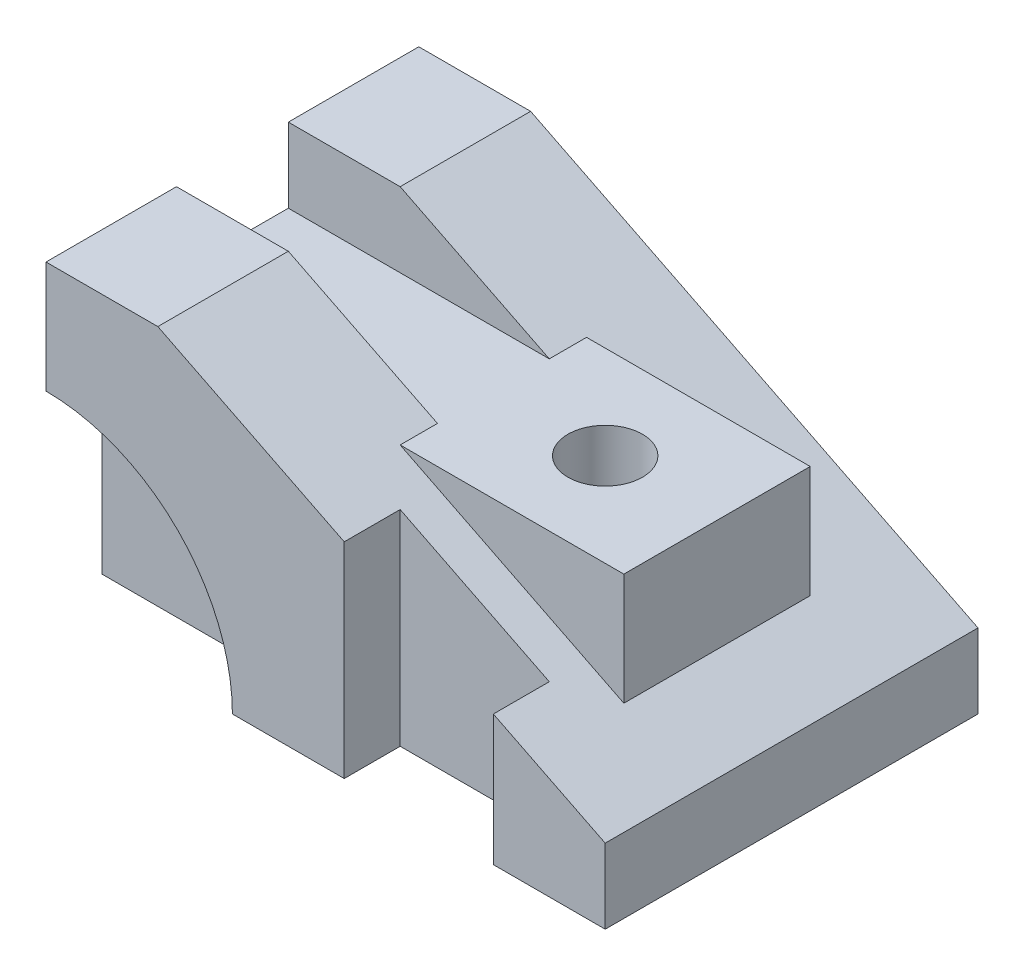
ISO-10303-21;
HEADER;
FILE_DESCRIPTION(('STEP AP214'),'2;1');
FILE_NAME('part.step','',(''),(''),'','','');
FILE_SCHEMA(('AUTOMOTIVE_DESIGN { 1 0 10303 214 1 1 1 1 }'));
ENDSEC;
DATA;
#1=APPLICATION_CONTEXT('core data for automotive mechanical design processes');
#2=APPLICATION_PROTOCOL_DEFINITION('international standard','automotive_design',2000,#1);
#3=PRODUCT_CONTEXT('',#1,'mechanical');
#4=PRODUCT('Part','Part','',(#3));
#5=PRODUCT_RELATED_PRODUCT_CATEGORY('part','',(#4));
#6=PRODUCT_DEFINITION_FORMATION('','',#4);
#7=PRODUCT_DEFINITION_CONTEXT('part definition',#1,'design');
#8=PRODUCT_DEFINITION('design','',#6,#7);
#9=PRODUCT_DEFINITION_SHAPE('','',#8);
#10=(LENGTH_UNIT() NAMED_UNIT(*) SI_UNIT(.MILLI.,.METRE.));
#11=(NAMED_UNIT(*) PLANE_ANGLE_UNIT() SI_UNIT($,.RADIAN.));
#12=(NAMED_UNIT(*) SI_UNIT($,.STERADIAN.) SOLID_ANGLE_UNIT());
#13=UNCERTAINTY_MEASURE_WITH_UNIT(LENGTH_MEASURE(1.E-05),#10,'distance_accuracy_value','');
#14=(GEOMETRIC_REPRESENTATION_CONTEXT(3) GLOBAL_UNCERTAINTY_ASSIGNED_CONTEXT((#13)) GLOBAL_UNIT_ASSIGNED_CONTEXT((#10,
#11,#12)) REPRESENTATION_CONTEXT('',''));
#15=CARTESIAN_POINT('',(0.,0.,0.));
#16=DIRECTION('',(0.,0.,1.));
#17=DIRECTION('',(1.,0.,0.));
#18=AXIS2_PLACEMENT_3D('',#15,#16,#17);
#19=CARTESIAN_POINT('',(0.,0.,50.));
#20=DIRECTION('',(0.,0.,1.));
#21=DIRECTION('',(1.,0.,0.));
#22=AXIS2_PLACEMENT_3D('',#19,#20,#21);
#23=PLANE('',#22);
#24=DIRECTION('',(0.,-1.,0.));
#25=VECTOR('',#24,1.);
#26=CARTESIAN_POINT('',(80.,0.,50.));
#27=LINE('',#26,#25);
#28=CARTESIAN_POINT('',(80.,55.,50.));
#29=VERTEX_POINT('',#28);
#30=CARTESIAN_POINT('',(80.,0.,50.));
#31=VERTEX_POINT('',#30);
#32=EDGE_CURVE('E11',#29,#31,#27,.T.);
#33=ORIENTED_EDGE('',*,*,#32,.F.);
#34=DIRECTION('',(-0.894427190999916,0.447213595499958,0.));
#35=VECTOR('',#34,1.);
#36=CARTESIAN_POINT('',(150.,20.,50.));
#37=LINE('',#36,#35);
#38=CARTESIAN_POINT('',(30.,80.,50.));
#39=VERTEX_POINT('',#38);
#40=EDGE_CURVE('E333',#29,#39,#37,.T.);
#41=ORIENTED_EDGE('',*,*,#40,.T.);
#42=DIRECTION('',(-1.,0.,0.));
#43=VECTOR('',#42,1.);
#44=CARTESIAN_POINT('',(30.,80.,50.));
#45=LINE('',#44,#43);
#46=CARTESIAN_POINT('',(0.,80.,50.));
#47=VERTEX_POINT('',#46);
#48=EDGE_CURVE('E338',#39,#47,#45,.T.);
#49=ORIENTED_EDGE('',*,*,#48,.T.);
#50=DIRECTION('',(0.,-1.,0.));
#51=VECTOR('',#50,1.);
#52=CARTESIAN_POINT('',(0.,80.,50.));
#53=LINE('',#52,#51);
#54=CARTESIAN_POINT('',(0.,50.,50.));
#55=VERTEX_POINT('',#54);
#56=EDGE_CURVE('E322',#47,#55,#53,.T.);
#57=ORIENTED_EDGE('',*,*,#56,.T.);
#58=CARTESIAN_POINT('',(0.,0.,50.));
#59=DIRECTION('',(0.,0.,1.));
#60=DIRECTION('',(1.,0.,0.));
#61=AXIS2_PLACEMENT_3D('',#58,#59,#60);
#62=CIRCLE('',#61,50.);
#63=CARTESIAN_POINT('',(50.,0.,50.));
#64=VERTEX_POINT('',#63);
#65=EDGE_CURVE('E277',#64,#55,#62,.T.);
#66=ORIENTED_EDGE('',*,*,#65,.F.);
#67=DIRECTION('',(1.,0.,0.));
#68=VECTOR('',#67,1.);
#69=CARTESIAN_POINT('',(0.,0.,50.));
#70=LINE('',#69,#68);
#71=EDGE_CURVE('E327',#64,#31,#70,.T.);
#72=ORIENTED_EDGE('',*,*,#71,.T.);
#73=EDGE_LOOP('',(#33,#41,#49,#57,#66,#72));
#74=FACE_BOUND('',#73,.T.);
#75=ADVANCED_FACE('F47',(#74),#23,.T.);
#76=CARTESIAN_POINT('',(0.,80.,50.));
#77=DIRECTION('',(1.,0.,0.));
#78=DIRECTION('',(0.,1.,0.));
#79=AXIS2_PLACEMENT_3D('',#76,#77,#78);
#80=PLANE('',#79);
#81=DIRECTION('',(0.,1.,0.));
#82=VECTOR('',#81,1.);
#83=CARTESIAN_POINT('',(0.,80.,15.));
#84=LINE('',#83,#82);
#85=CARTESIAN_POINT('',(0.,60.,15.));
#86=VERTEX_POINT('',#85);
#87=CARTESIAN_POINT('',(0.,80.,15.));
#88=VERTEX_POINT('',#87);
#89=EDGE_CURVE('E242',#86,#88,#84,.T.);
#90=ORIENTED_EDGE('',*,*,#89,.F.);
#91=DIRECTION('',(0.,0.,1.));
#92=VECTOR('',#91,1.);
#93=CARTESIAN_POINT('',(0.,60.,50.));
#94=LINE('',#93,#92);
#95=CARTESIAN_POINT('',(0.,60.,-15.));
#96=VERTEX_POINT('',#95);
#97=EDGE_CURVE('E245',#96,#86,#94,.T.);
#98=ORIENTED_EDGE('',*,*,#97,.F.);
#99=DIRECTION('',(0.,-1.,0.));
#100=VECTOR('',#99,1.);
#101=CARTESIAN_POINT('',(0.,80.,-15.));
#102=LINE('',#101,#100);
#103=CARTESIAN_POINT('',(0.,80.,-15.));
#104=VERTEX_POINT('',#103);
#105=EDGE_CURVE('E236',#104,#96,#102,.T.);
#106=ORIENTED_EDGE('',*,*,#105,.F.);
#107=DIRECTION('',(0.,0.,-1.));
#108=VECTOR('',#107,1.);
#109=CARTESIAN_POINT('',(0.,80.,50.));
#110=LINE('',#109,#108);
#111=CARTESIAN_POINT('',(0.,80.,-50.));
#112=VERTEX_POINT('',#111);
#113=EDGE_CURVE('E341',#104,#112,#110,.T.);
#114=ORIENTED_EDGE('',*,*,#113,.T.);
#115=DIRECTION('',(0.,-1.,0.));
#116=VECTOR('',#115,1.);
#117=CARTESIAN_POINT('',(0.,80.,-50.));
#118=LINE('',#117,#116);
#119=CARTESIAN_POINT('',(0.,0.,-50.));
#120=VERTEX_POINT('',#119);
#121=EDGE_CURVE('E302',#112,#120,#118,.T.);
#122=ORIENTED_EDGE('',*,*,#121,.T.);
#123=DIRECTION('',(0.,0.,-1.));
#124=VECTOR('',#123,1.);
#125=CARTESIAN_POINT('',(0.,0.,50.));
#126=LINE('',#125,#124);
#127=CARTESIAN_POINT('',(0.,0.,35.));
#128=VERTEX_POINT('',#127);
#129=EDGE_CURVE('E357',#128,#120,#126,.T.);
#130=ORIENTED_EDGE('',*,*,#129,.F.);
#131=DIRECTION('',(0.,-1.,0.));
#132=VECTOR('',#131,1.);
#133=CARTESIAN_POINT('',(0.,80.,35.));
#134=LINE('',#133,#132);
#135=CARTESIAN_POINT('',(0.,50.,35.));
#136=VERTEX_POINT('',#135);
#137=EDGE_CURVE('E299',#136,#128,#134,.T.);
#138=ORIENTED_EDGE('',*,*,#137,.F.);
#139=DIRECTION('',(0.,0.,1.));
#140=VECTOR('',#139,1.);
#141=CARTESIAN_POINT('',(0.,50.,35.));
#142=LINE('',#141,#140);
#143=EDGE_CURVE('E295',#136,#55,#142,.T.);
#144=ORIENTED_EDGE('',*,*,#143,.T.);
#145=ORIENTED_EDGE('',*,*,#56,.F.);
#146=EDGE_CURVE('E342',#47,#88,#110,.T.);
#147=ORIENTED_EDGE('',*,*,#146,.T.);
#148=EDGE_LOOP('',(#90,#98,#106,#114,#122,#130,#138,#144,#145,#147));
#149=FACE_BOUND('',#148,.T.);
#150=ADVANCED_FACE('F49',(#149),#80,.F.);
#151=CARTESIAN_POINT('',(150.,20.,50.));
#152=DIRECTION('',(-0.447213595499958,-0.894427190999916,0.));
#153=DIRECTION('',(0.894427190999916,-0.447213595499958,0.));
#154=AXIS2_PLACEMENT_3D('',#151,#152,#153);
#155=PLANE('',#154);
#156=ORIENTED_EDGE('',*,*,#40,.F.);
#157=DIRECTION('',(0.,0.,-1.));
#158=VECTOR('',#157,1.);
#159=CARTESIAN_POINT('',(80.,55.,50.));
#160=LINE('',#159,#158);
#161=CARTESIAN_POINT('',(80.,55.,35.));
#162=VERTEX_POINT('',#161);
#163=EDGE_CURVE('E207',#29,#162,#160,.T.);
#164=ORIENTED_EDGE('',*,*,#163,.T.);
#165=DIRECTION('',(0.894427190999916,-0.447213595499958,0.));
#166=VECTOR('',#165,1.);
#167=CARTESIAN_POINT('',(150.,20.,35.));
#168=LINE('',#167,#166);
#169=CARTESIAN_POINT('',(120.,35.,35.));
#170=VERTEX_POINT('',#169);
#171=EDGE_CURVE('E179',#162,#170,#168,.T.);
#172=ORIENTED_EDGE('',*,*,#171,.T.);
#173=DIRECTION('',(0.,0.,1.));
#174=VECTOR('',#173,1.);
#175=CARTESIAN_POINT('',(120.,35.,50.));
#176=LINE('',#175,#174);
#177=CARTESIAN_POINT('',(120.,35.,50.));
#178=VERTEX_POINT('',#177);
#179=EDGE_CURVE('E202',#170,#178,#176,.T.);
#180=ORIENTED_EDGE('',*,*,#179,.T.);
#181=CARTESIAN_POINT('',(150.,20.,50.));
#182=VERTEX_POINT('',#181);
#183=EDGE_CURVE('E334',#182,#178,#37,.T.);
#184=ORIENTED_EDGE('',*,*,#183,.F.);
#185=DIRECTION('',(0.,0.,-1.));
#186=VECTOR('',#185,1.);
#187=CARTESIAN_POINT('',(150.,20.,50.));
#188=LINE('',#187,#186);
#189=CARTESIAN_POINT('',(150.,20.,-50.));
#190=VERTEX_POINT('',#189);
#191=EDGE_CURVE('E351',#182,#190,#188,.T.);
#192=ORIENTED_EDGE('',*,*,#191,.T.);
#193=DIRECTION('',(-0.894427190999916,0.447213595499958,0.));
#194=VECTOR('',#193,1.);
#195=CARTESIAN_POINT('',(150.,20.,-50.));
#196=LINE('',#195,#194);
#197=CARTESIAN_POINT('',(30.,80.,-50.));
#198=VERTEX_POINT('',#197);
#199=EDGE_CURVE('E314',#190,#198,#196,.T.);
#200=ORIENTED_EDGE('',*,*,#199,.T.);
#201=DIRECTION('',(0.,0.,-1.));
#202=VECTOR('',#201,1.);
#203=CARTESIAN_POINT('',(30.,80.,50.));
#204=LINE('',#203,#202);
#205=CARTESIAN_POINT('',(30.,80.,-15.));
#206=VERTEX_POINT('',#205);
#207=EDGE_CURVE('E346',#206,#198,#204,.T.);
#208=ORIENTED_EDGE('',*,*,#207,.F.);
#209=DIRECTION('',(-0.894427190999916,0.447213595499958,0.));
#210=VECTOR('',#209,1.);
#211=CARTESIAN_POINT('',(150.,20.,-15.));
#212=LINE('',#211,#210);
#213=CARTESIAN_POINT('',(70.,60.,-15.));
#214=VERTEX_POINT('',#213);
#215=EDGE_CURVE('E71',#214,#206,#212,.T.);
#216=ORIENTED_EDGE('',*,*,#215,.F.);
#217=DIRECTION('',(0.,0.,1.));
#218=VECTOR('',#217,1.);
#219=CARTESIAN_POINT('',(70.,60.,-25.));
#220=LINE('',#219,#218);
#221=CARTESIAN_POINT('',(70.,60.,-25.));
#222=VERTEX_POINT('',#221);
#223=EDGE_CURVE('E273',#222,#214,#220,.T.);
#224=ORIENTED_EDGE('',*,*,#223,.F.);
#225=DIRECTION('',(0.894427190999916,-0.447213595499958,0.));
#226=VECTOR('',#225,1.);
#227=CARTESIAN_POINT('',(130.,30.,-25.));
#228=LINE('',#227,#226);
#229=CARTESIAN_POINT('',(130.,30.,-25.));
#230=VERTEX_POINT('',#229);
#231=EDGE_CURVE('E260',#222,#230,#228,.T.);
#232=ORIENTED_EDGE('',*,*,#231,.T.);
#233=DIRECTION('',(0.,0.,1.));
#234=VECTOR('',#233,1.);
#235=CARTESIAN_POINT('',(130.,30.,-25.));
#236=LINE('',#235,#234);
#237=CARTESIAN_POINT('',(130.,30.,25.));
#238=VERTEX_POINT('',#237);
#239=EDGE_CURVE('E272',#230,#238,#236,.T.);
#240=ORIENTED_EDGE('',*,*,#239,.T.);
#241=DIRECTION('',(0.894427190999916,-0.447213595499958,0.));
#242=VECTOR('',#241,1.);
#243=CARTESIAN_POINT('',(130.,30.,25.));
#244=LINE('',#243,#242);
#245=CARTESIAN_POINT('',(70.,60.,25.));
#246=VERTEX_POINT('',#245);
#247=EDGE_CURVE('E248',#246,#238,#244,.T.);
#248=ORIENTED_EDGE('',*,*,#247,.F.);
#249=CARTESIAN_POINT('',(70.,60.,15.));
#250=VERTEX_POINT('',#249);
#251=EDGE_CURVE('E278',#250,#246,#220,.T.);
#252=ORIENTED_EDGE('',*,*,#251,.F.);
#253=DIRECTION('',(0.894427190999916,-0.447213595499958,0.));
#254=VECTOR('',#253,1.);
#255=CARTESIAN_POINT('',(150.,20.,15.));
#256=LINE('',#255,#254);
#257=CARTESIAN_POINT('',(30.,80.,15.));
#258=VERTEX_POINT('',#257);
#259=EDGE_CURVE('E239',#258,#250,#256,.T.);
#260=ORIENTED_EDGE('',*,*,#259,.F.);
#261=EDGE_CURVE('E347',#39,#258,#204,.T.);
#262=ORIENTED_EDGE('',*,*,#261,.F.);
#263=EDGE_LOOP('',(#156,#164,#172,#180,#184,#192,#200,#208,#216,#224,#232,#240,#248,#252,#260,#262));
#264=FACE_BOUND('',#263,.T.);
#265=ADVANCED_FACE('F368',(#264),#155,.F.);
#266=CARTESIAN_POINT('',(30.,80.,50.));
#267=DIRECTION('',(0.,-1.,0.));
#268=DIRECTION('',(0.,0.,-1.));
#269=AXIS2_PLACEMENT_3D('',#266,#267,#268);
#270=PLANE('',#269);
#271=DIRECTION('',(1.,0.,0.));
#272=VECTOR('',#271,1.);
#273=CARTESIAN_POINT('',(-18.4771676862936,80.,15.));
#274=LINE('',#273,#272);
#275=EDGE_CURVE('E221',#88,#258,#274,.T.);
#276=ORIENTED_EDGE('',*,*,#275,.F.);
#277=ORIENTED_EDGE('',*,*,#146,.F.);
#278=ORIENTED_EDGE('',*,*,#48,.F.);
#279=ORIENTED_EDGE('',*,*,#261,.T.);
#280=EDGE_LOOP('',(#276,#277,#278,#279));
#281=FACE_BOUND('',#280,.T.);
#282=ADVANCED_FACE('F441',(#281),#270,.F.);
#283=DIRECTION('',(-1.,0.,0.));
#284=VECTOR('',#283,1.);
#285=CARTESIAN_POINT('',(-18.4771676862936,80.,-15.));
#286=LINE('',#285,#284);
#287=EDGE_CURVE('E224',#206,#104,#286,.T.);
#288=ORIENTED_EDGE('',*,*,#287,.F.);
#289=ORIENTED_EDGE('',*,*,#207,.T.);
#290=DIRECTION('',(-1.,0.,0.));
#291=VECTOR('',#290,1.);
#292=CARTESIAN_POINT('',(30.,80.,-50.));
#293=LINE('',#292,#291);
#294=EDGE_CURVE('E318',#198,#112,#293,.T.);
#295=ORIENTED_EDGE('',*,*,#294,.T.);
#296=ORIENTED_EDGE('',*,*,#113,.F.);
#297=EDGE_LOOP('',(#288,#289,#295,#296));
#298=FACE_BOUND('',#297,.T.);
#299=ADVANCED_FACE('F385',(#298),#270,.F.);
#300=CARTESIAN_POINT('',(0.,0.,50.));
#301=DIRECTION('',(0.,1.,0.));
#302=DIRECTION('',(0.,0.,1.));
#303=AXIS2_PLACEMENT_3D('',#300,#301,#302);
#304=PLANE('',#303);
#305=CARTESIAN_POINT('',(100.,0.,0.));
#306=DIRECTION('',(0.,1.,0.));
#307=DIRECTION('',(0.,0.,1.));
#308=AXIS2_PLACEMENT_3D('',#305,#306,#307);
#309=CIRCLE('',#308,9.99999999999999);
#310=CARTESIAN_POINT('',(100.,0.,9.99999999999999));
#311=VERTEX_POINT('',#310);
#312=EDGE_CURVE('E213',#311,#311,#309,.T.);
#313=ORIENTED_EDGE('',*,*,#312,.T.);
#314=EDGE_LOOP('',(#313));
#315=FACE_BOUND('',#314,.T.);
#316=DIRECTION('',(1.,0.,0.));
#317=VECTOR('',#316,1.);
#318=CARTESIAN_POINT('',(80.,0.,35.));
#319=LINE('',#318,#317);
#320=CARTESIAN_POINT('',(80.,0.,35.));
#321=VERTEX_POINT('',#320);
#322=CARTESIAN_POINT('',(120.,0.,35.));
#323=VERTEX_POINT('',#322);
#324=EDGE_CURVE('E177',#321,#323,#319,.T.);
#325=ORIENTED_EDGE('',*,*,#324,.F.);
#326=DIRECTION('',(0.,0.,-1.));
#327=VECTOR('',#326,1.);
#328=CARTESIAN_POINT('',(80.,0.,50.));
#329=LINE('',#328,#327);
#330=EDGE_CURVE('E186',#31,#321,#329,.T.);
#331=ORIENTED_EDGE('',*,*,#330,.F.);
#332=ORIENTED_EDGE('',*,*,#71,.F.);
#333=DIRECTION('',(0.,0.,1.));
#334=VECTOR('',#333,1.);
#335=CARTESIAN_POINT('',(50.,0.,35.));
#336=LINE('',#335,#334);
#337=CARTESIAN_POINT('',(50.,0.,35.));
#338=VERTEX_POINT('',#337);
#339=EDGE_CURVE('E289',#64,#338,#336,.F.);
#340=ORIENTED_EDGE('',*,*,#339,.T.);
#341=DIRECTION('',(1.,0.,0.));
#342=VECTOR('',#341,1.);
#343=CARTESIAN_POINT('',(0.,0.,35.));
#344=LINE('',#343,#342);
#345=EDGE_CURVE('E360',#128,#338,#344,.T.);
#346=ORIENTED_EDGE('',*,*,#345,.F.);
#347=ORIENTED_EDGE('',*,*,#129,.T.);
#348=DIRECTION('',(1.,0.,0.));
#349=VECTOR('',#348,1.);
#350=CARTESIAN_POINT('',(0.,0.,-50.));
#351=LINE('',#350,#349);
#352=CARTESIAN_POINT('',(150.,0.,-50.));
#353=VERTEX_POINT('',#352);
#354=EDGE_CURVE('E306',#120,#353,#351,.T.);
#355=ORIENTED_EDGE('',*,*,#354,.T.);
#356=DIRECTION('',(0.,0.,-1.));
#357=VECTOR('',#356,1.);
#358=CARTESIAN_POINT('',(150.,0.,50.));
#359=LINE('',#358,#357);
#360=CARTESIAN_POINT('',(150.,0.,50.));
#361=VERTEX_POINT('',#360);
#362=EDGE_CURVE('E354',#361,#353,#359,.T.);
#363=ORIENTED_EDGE('',*,*,#362,.F.);
#364=CARTESIAN_POINT('',(120.,0.,50.));
#365=VERTEX_POINT('',#364);
#366=EDGE_CURVE('E326',#365,#361,#70,.T.);
#367=ORIENTED_EDGE('',*,*,#366,.F.);
#368=DIRECTION('',(0.,0.,1.));
#369=VECTOR('',#368,1.);
#370=CARTESIAN_POINT('',(120.,0.,50.));
#371=LINE('',#370,#369);
#372=EDGE_CURVE('E63',#323,#365,#371,.T.);
#373=ORIENTED_EDGE('',*,*,#372,.F.);
#374=EDGE_LOOP('',(#325,#331,#332,#340,#346,#347,#355,#363,#367,#373));
#375=FACE_BOUND('',#374,.T.);
#376=ADVANCED_FACE('F194',(#315,#375),#304,.F.);
#377=CARTESIAN_POINT('',(150.,0.,50.));
#378=DIRECTION('',(-1.,0.,0.));
#379=DIRECTION('',(0.,0.,1.));
#380=AXIS2_PLACEMENT_3D('',#377,#378,#379);
#381=PLANE('',#380);
#382=ORIENTED_EDGE('',*,*,#362,.T.);
#383=DIRECTION('',(0.,1.,0.));
#384=VECTOR('',#383,1.);
#385=CARTESIAN_POINT('',(150.,0.,-50.));
#386=LINE('',#385,#384);
#387=EDGE_CURVE('E310',#353,#190,#386,.T.);
#388=ORIENTED_EDGE('',*,*,#387,.T.);
#389=ORIENTED_EDGE('',*,*,#191,.F.);
#390=DIRECTION('',(0.,1.,0.));
#391=VECTOR('',#390,1.);
#392=CARTESIAN_POINT('',(150.,0.,50.));
#393=LINE('',#392,#391);
#394=EDGE_CURVE('E330',#361,#182,#393,.T.);
#395=ORIENTED_EDGE('',*,*,#394,.F.);
#396=EDGE_LOOP('',(#382,#388,#389,#395));
#397=FACE_BOUND('',#396,.T.);
#398=ADVANCED_FACE('F374',(#397),#381,.F.);
#399=DIRECTION('',(0.,1.,0.));
#400=VECTOR('',#399,1.);
#401=CARTESIAN_POINT('',(120.,0.,50.));
#402=LINE('',#401,#400);
#403=EDGE_CURVE('E56',#365,#178,#402,.T.);
#404=ORIENTED_EDGE('',*,*,#403,.F.);
#405=ORIENTED_EDGE('',*,*,#366,.T.);
#406=ORIENTED_EDGE('',*,*,#394,.T.);
#407=ORIENTED_EDGE('',*,*,#183,.T.);
#408=EDGE_LOOP('',(#404,#405,#406,#407));
#409=FACE_BOUND('',#408,.T.);
#410=ADVANCED_FACE('F369',(#409),#23,.T.);
#411=CARTESIAN_POINT('',(0.,0.,-50.));
#412=DIRECTION('',(0.,0.,1.));
#413=DIRECTION('',(1.,0.,0.));
#414=AXIS2_PLACEMENT_3D('',#411,#412,#413);
#415=PLANE('',#414);
#416=ORIENTED_EDGE('',*,*,#121,.F.);
#417=ORIENTED_EDGE('',*,*,#294,.F.);
#418=ORIENTED_EDGE('',*,*,#199,.F.);
#419=ORIENTED_EDGE('',*,*,#387,.F.);
#420=ORIENTED_EDGE('',*,*,#354,.F.);
#421=EDGE_LOOP('',(#416,#417,#418,#419,#420));
#422=FACE_BOUND('',#421,.T.);
#423=ADVANCED_FACE('F381',(#422),#415,.F.);
#424=CARTESIAN_POINT('',(0.,0.,35.));
#425=DIRECTION('',(0.,0.,1.));
#426=DIRECTION('',(1.,0.,0.));
#427=AXIS2_PLACEMENT_3D('',#424,#425,#426);
#428=PLANE('',#427);
#429=ORIENTED_EDGE('',*,*,#137,.T.);
#430=ORIENTED_EDGE('',*,*,#345,.T.);
#431=CARTESIAN_POINT('',(0.,0.,35.));
#432=DIRECTION('',(0.,0.,1.));
#433=DIRECTION('',(1.,0.,0.));
#434=AXIS2_PLACEMENT_3D('',#431,#432,#433);
#435=CIRCLE('',#434,50.);
#436=EDGE_CURVE('E285',#338,#136,#435,.T.);
#437=ORIENTED_EDGE('',*,*,#436,.T.);
#438=EDGE_LOOP('',(#429,#430,#437));
#439=FACE_BOUND('',#438,.T.);
#440=ADVANCED_FACE('F434',(#439),#428,.T.);
#441=CARTESIAN_POINT('',(0.,0.,35.));
#442=DIRECTION('',(0.,0.,1.));
#443=DIRECTION('',(1.,0.,0.));
#444=AXIS2_PLACEMENT_3D('',#441,#442,#443);
#445=CYLINDRICAL_SURFACE('',#444,50.);
#446=ORIENTED_EDGE('',*,*,#436,.F.);
#447=ORIENTED_EDGE('',*,*,#339,.F.);
#448=ORIENTED_EDGE('',*,*,#65,.T.);
#449=ORIENTED_EDGE('',*,*,#143,.F.);
#450=EDGE_LOOP('',(#446,#447,#448,#449));
#451=FACE_BOUND('',#450,.T.);
#452=ADVANCED_FACE('F515',(#451),#445,.F.);
#453=CARTESIAN_POINT('',(70.,60.,-25.));
#454=DIRECTION('',(0.,1.,0.));
#455=DIRECTION('',(0.,0.,1.));
#456=AXIS2_PLACEMENT_3D('',#453,#454,#455);
#457=PLANE('',#456);
#458=CARTESIAN_POINT('',(100.,60.,0.));
#459=DIRECTION('',(0.,1.,0.));
#460=DIRECTION('',(0.,0.,1.));
#461=AXIS2_PLACEMENT_3D('',#458,#459,#460);
#462=CIRCLE('',#461,9.99999999999999);
#463=CARTESIAN_POINT('',(100.,60.,9.99999999999999));
#464=VERTEX_POINT('',#463);
#465=EDGE_CURVE('E212',#464,#464,#462,.T.);
#466=ORIENTED_EDGE('',*,*,#465,.F.);
#467=EDGE_LOOP('',(#466));
#468=FACE_BOUND('',#467,.T.);
#469=ORIENTED_EDGE('',*,*,#223,.T.);
#470=DIRECTION('',(-1.,0.,0.));
#471=VECTOR('',#470,1.);
#472=CARTESIAN_POINT('',(-18.4771676862936,60.,-15.));
#473=LINE('',#472,#471);
#474=EDGE_CURVE('E225',#214,#96,#473,.T.);
#475=ORIENTED_EDGE('',*,*,#474,.T.);
#476=ORIENTED_EDGE('',*,*,#97,.T.);
#477=DIRECTION('',(1.,0.,0.));
#478=VECTOR('',#477,1.);
#479=CARTESIAN_POINT('',(-18.4771676862936,60.,15.));
#480=LINE('',#479,#478);
#481=EDGE_CURVE('E217',#86,#250,#480,.T.);
#482=ORIENTED_EDGE('',*,*,#481,.T.);
#483=ORIENTED_EDGE('',*,*,#251,.T.);
#484=DIRECTION('',(-1.,0.,0.));
#485=VECTOR('',#484,1.);
#486=CARTESIAN_POINT('',(70.,60.,25.));
#487=LINE('',#486,#485);
#488=CARTESIAN_POINT('',(130.,60.,25.));
#489=VERTEX_POINT('',#488);
#490=EDGE_CURVE('E256',#489,#246,#487,.T.);
#491=ORIENTED_EDGE('',*,*,#490,.F.);
#492=DIRECTION('',(0.,0.,1.));
#493=VECTOR('',#492,1.);
#494=CARTESIAN_POINT('',(130.,60.,-25.));
#495=LINE('',#494,#493);
#496=CARTESIAN_POINT('',(130.,60.,-25.));
#497=VERTEX_POINT('',#496);
#498=EDGE_CURVE('E279',#497,#489,#495,.T.);
#499=ORIENTED_EDGE('',*,*,#498,.F.);
#500=DIRECTION('',(-1.,0.,0.));
#501=VECTOR('',#500,1.);
#502=CARTESIAN_POINT('',(70.,60.,-25.));
#503=LINE('',#502,#501);
#504=EDGE_CURVE('E268',#497,#222,#503,.T.);
#505=ORIENTED_EDGE('',*,*,#504,.T.);
#506=EDGE_LOOP('',(#469,#475,#476,#482,#483,#491,#499,#505));
#507=FACE_BOUND('',#506,.T.);
#508=ADVANCED_FACE('F394',(#468,#507),#457,.T.);
#509=CARTESIAN_POINT('',(130.,60.,-25.));
#510=DIRECTION('',(1.,0.,0.));
#511=DIRECTION('',(0.,0.,-1.));
#512=AXIS2_PLACEMENT_3D('',#509,#510,#511);
#513=PLANE('',#512);
#514=ORIENTED_EDGE('',*,*,#498,.T.);
#515=DIRECTION('',(0.,1.,0.));
#516=VECTOR('',#515,1.);
#517=CARTESIAN_POINT('',(130.,60.,25.));
#518=LINE('',#517,#516);
#519=EDGE_CURVE('E252',#238,#489,#518,.T.);
#520=ORIENTED_EDGE('',*,*,#519,.F.);
#521=ORIENTED_EDGE('',*,*,#239,.F.);
#522=DIRECTION('',(0.,1.,0.));
#523=VECTOR('',#522,1.);
#524=CARTESIAN_POINT('',(130.,60.,-25.));
#525=LINE('',#524,#523);
#526=EDGE_CURVE('E264',#230,#497,#525,.T.);
#527=ORIENTED_EDGE('',*,*,#526,.T.);
#528=EDGE_LOOP('',(#514,#520,#521,#527));
#529=FACE_BOUND('',#528,.T.);
#530=ADVANCED_FACE('F403',(#529),#513,.T.);
#531=CARTESIAN_POINT('',(0.,0.,-25.));
#532=DIRECTION('',(0.,0.,1.));
#533=DIRECTION('',(1.,0.,0.));
#534=AXIS2_PLACEMENT_3D('',#531,#532,#533);
#535=PLANE('',#534);
#536=ORIENTED_EDGE('',*,*,#231,.F.);
#537=ORIENTED_EDGE('',*,*,#504,.F.);
#538=ORIENTED_EDGE('',*,*,#526,.F.);
#539=EDGE_LOOP('',(#536,#537,#538));
#540=FACE_BOUND('',#539,.T.);
#541=ADVANCED_FACE('F406',(#540),#535,.F.);
#542=CARTESIAN_POINT('',(0.,0.,25.));
#543=DIRECTION('',(0.,0.,1.));
#544=DIRECTION('',(1.,0.,0.));
#545=AXIS2_PLACEMENT_3D('',#542,#543,#544);
#546=PLANE('',#545);
#547=ORIENTED_EDGE('',*,*,#247,.T.);
#548=ORIENTED_EDGE('',*,*,#519,.T.);
#549=ORIENTED_EDGE('',*,*,#490,.T.);
#550=EDGE_LOOP('',(#547,#548,#549));
#551=FACE_BOUND('',#550,.T.);
#552=ADVANCED_FACE('F399',(#551),#546,.T.);
#553=CARTESIAN_POINT('',(-18.4771676862936,80.,15.));
#554=DIRECTION('',(0.,0.,-1.));
#555=DIRECTION('',(-1.,0.,0.));
#556=AXIS2_PLACEMENT_3D('',#553,#554,#555);
#557=PLANE('',#556);
#558=ORIENTED_EDGE('',*,*,#89,.T.);
#559=ORIENTED_EDGE('',*,*,#275,.T.);
#560=ORIENTED_EDGE('',*,*,#259,.T.);
#561=ORIENTED_EDGE('',*,*,#481,.F.);
#562=EDGE_LOOP('',(#558,#559,#560,#561));
#563=FACE_BOUND('',#562,.T.);
#564=ADVANCED_FACE('F413',(#563),#557,.T.);
#565=CARTESIAN_POINT('',(-18.4771676862936,80.,-15.));
#566=DIRECTION('',(0.,0.,1.));
#567=DIRECTION('',(1.,0.,0.));
#568=AXIS2_PLACEMENT_3D('',#565,#566,#567);
#569=PLANE('',#568);
#570=ORIENTED_EDGE('',*,*,#105,.T.);
#571=ORIENTED_EDGE('',*,*,#474,.F.);
#572=ORIENTED_EDGE('',*,*,#215,.T.);
#573=ORIENTED_EDGE('',*,*,#287,.T.);
#574=EDGE_LOOP('',(#570,#571,#572,#573));
#575=FACE_BOUND('',#574,.T.);
#576=ADVANCED_FACE('F458',(#575),#569,.T.);
#577=CARTESIAN_POINT('',(100.,0.,0.));
#578=DIRECTION('',(0.,1.,0.));
#579=DIRECTION('',(0.,0.,1.));
#580=AXIS2_PLACEMENT_3D('',#577,#578,#579);
#581=CYLINDRICAL_SURFACE('',#580,9.99999999999999);
#582=ORIENTED_EDGE('',*,*,#312,.F.);
#583=EDGE_LOOP('',(#582));
#584=FACE_BOUND('',#583,.T.);
#585=ORIENTED_EDGE('',*,*,#465,.T.);
#586=EDGE_LOOP('',(#585));
#587=FACE_BOUND('',#586,.T.);
#588=ADVANCED_FACE('F463',(#584,#587),#581,.F.);
#589=CARTESIAN_POINT('',(80.,80.,35.));
#590=DIRECTION('',(0.,0.,-1.));
#591=DIRECTION('',(-1.,0.,0.));
#592=AXIS2_PLACEMENT_3D('',#589,#590,#591);
#593=PLANE('',#592);
#594=DIRECTION('',(0.,-1.,0.));
#595=VECTOR('',#594,1.);
#596=CARTESIAN_POINT('',(80.,80.,35.));
#597=LINE('',#596,#595);
#598=EDGE_CURVE('E172',#162,#321,#597,.T.);
#599=ORIENTED_EDGE('',*,*,#598,.T.);
#600=ORIENTED_EDGE('',*,*,#324,.T.);
#601=DIRECTION('',(0.,-1.,0.));
#602=VECTOR('',#601,1.);
#603=CARTESIAN_POINT('',(120.,80.,35.));
#604=LINE('',#603,#602);
#605=EDGE_CURVE('E183',#170,#323,#604,.T.);
#606=ORIENTED_EDGE('',*,*,#605,.F.);
#607=ORIENTED_EDGE('',*,*,#171,.F.);
#608=EDGE_LOOP('',(#599,#600,#606,#607));
#609=FACE_BOUND('',#608,.T.);
#610=ADVANCED_FACE('F174',(#609),#593,.F.);
#611=CARTESIAN_POINT('',(80.,80.,50.));
#612=DIRECTION('',(-1.,0.,0.));
#613=DIRECTION('',(0.,0.,1.));
#614=AXIS2_PLACEMENT_3D('',#611,#612,#613);
#615=PLANE('',#614);
#616=ORIENTED_EDGE('',*,*,#32,.T.);
#617=ORIENTED_EDGE('',*,*,#330,.T.);
#618=ORIENTED_EDGE('',*,*,#598,.F.);
#619=ORIENTED_EDGE('',*,*,#163,.F.);
#620=EDGE_LOOP('',(#616,#617,#618,#619));
#621=FACE_BOUND('',#620,.T.);
#622=ADVANCED_FACE('F187',(#621),#615,.F.);
#623=CARTESIAN_POINT('',(120.,80.,50.));
#624=DIRECTION('',(1.,0.,0.));
#625=DIRECTION('',(0.,0.,-1.));
#626=AXIS2_PLACEMENT_3D('',#623,#624,#625);
#627=PLANE('',#626);
#628=ORIENTED_EDGE('',*,*,#605,.T.);
#629=ORIENTED_EDGE('',*,*,#372,.T.);
#630=ORIENTED_EDGE('',*,*,#403,.T.);
#631=ORIENTED_EDGE('',*,*,#179,.F.);
#632=EDGE_LOOP('',(#628,#629,#630,#631));
#633=FACE_BOUND('',#632,.T.);
#634=ADVANCED_FACE('F363',(#633),#627,.F.);
#635=CLOSED_SHELL('',(#75,#150,#265,#282,#299,#376,#398,#410,#423,#440,#452,#508,#530,#541,#552,
#564,#576,#588,#610,#622,#634));
#636=MANIFOLD_SOLID_BREP('B2',#635);
#637=ADVANCED_BREP_SHAPE_REPRESENTATION('',(#18,#636),#14);
#638=SHAPE_DEFINITION_REPRESENTATION(#9,#637);
ENDSEC;
END-ISO-10303-21;
